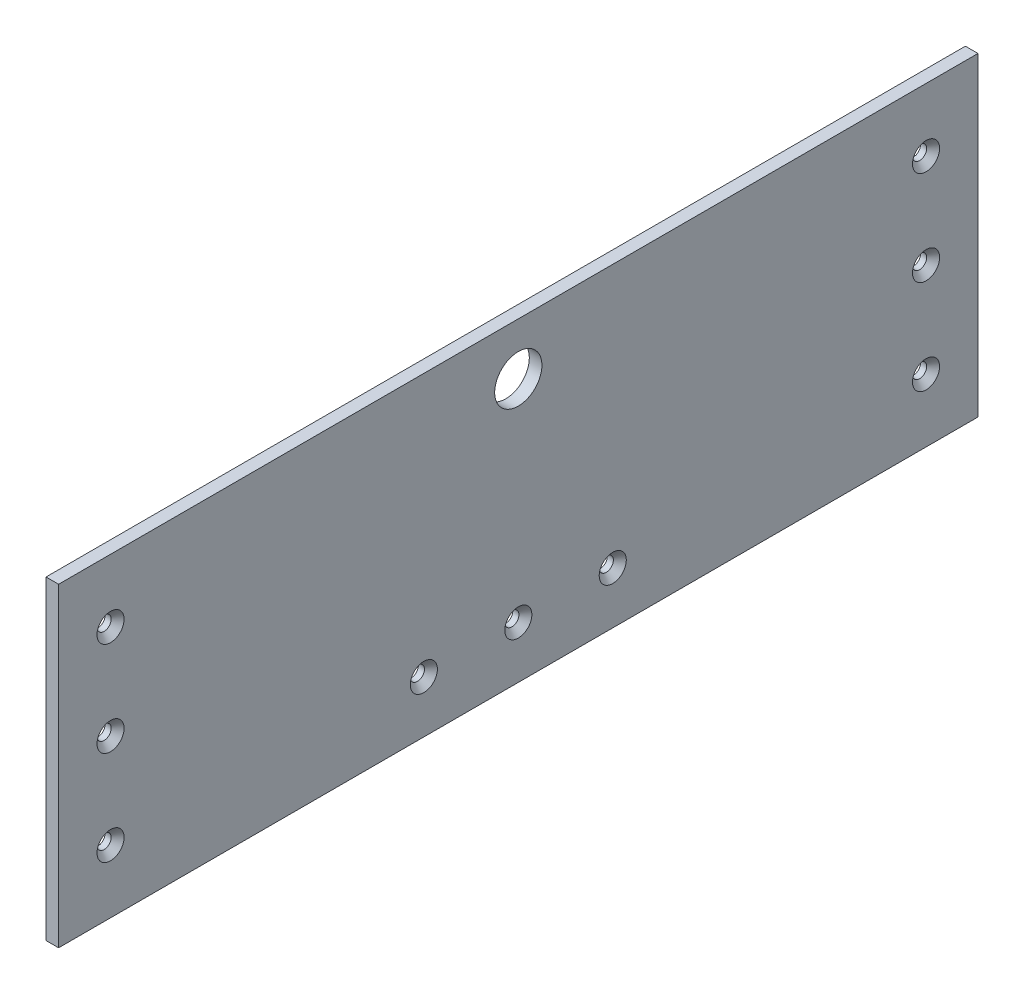
ISO-10303-21;
HEADER;
FILE_DESCRIPTION(('STEP AP214'),'2;1');
FILE_NAME('part.step','',(''),(''),'','','');
FILE_SCHEMA(('AUTOMOTIVE_DESIGN { 1 0 10303 214 1 1 1 1 }'));
ENDSEC;
DATA;
#1=APPLICATION_CONTEXT('core data for automotive mechanical design processes');
#2=APPLICATION_PROTOCOL_DEFINITION('international standard','automotive_design',2000,#1);
#3=PRODUCT_CONTEXT('',#1,'mechanical');
#4=PRODUCT('Part','Part','',(#3));
#5=PRODUCT_RELATED_PRODUCT_CATEGORY('part','',(#4));
#6=PRODUCT_DEFINITION_FORMATION('','',#4);
#7=PRODUCT_DEFINITION_CONTEXT('part definition',#1,'design');
#8=PRODUCT_DEFINITION('design','',#6,#7);
#9=PRODUCT_DEFINITION_SHAPE('','',#8);
#10=(LENGTH_UNIT() NAMED_UNIT(*) SI_UNIT(.MILLI.,.METRE.));
#11=(NAMED_UNIT(*) PLANE_ANGLE_UNIT() SI_UNIT($,.RADIAN.));
#12=(NAMED_UNIT(*) SI_UNIT($,.STERADIAN.) SOLID_ANGLE_UNIT());
#13=UNCERTAINTY_MEASURE_WITH_UNIT(LENGTH_MEASURE(1.E-05),#10,'distance_accuracy_value','');
#14=(GEOMETRIC_REPRESENTATION_CONTEXT(3) GLOBAL_UNCERTAINTY_ASSIGNED_CONTEXT((#13)) GLOBAL_UNIT_ASSIGNED_CONTEXT((#10,
#11,#12)) REPRESENTATION_CONTEXT('',''));
#15=CARTESIAN_POINT('',(0.,0.,0.));
#16=DIRECTION('',(0.,0.,1.));
#17=DIRECTION('',(1.,0.,0.));
#18=AXIS2_PLACEMENT_3D('',#15,#16,#17);
#19=CARTESIAN_POINT('',(3.99999999996226,30.,-129.5));
#20=DIRECTION('',(1.,0.,0.));
#21=DIRECTION('',(0.,0.,-1.));
#22=AXIS2_PLACEMENT_3D('',#19,#20,#21);
#23=CONICAL_SURFACE('',#22,4.29999999995112,0.785398163397448);
#24=CARTESIAN_POINT('',(1.95,30.,-129.5));
#25=DIRECTION('',(1.,0.,0.));
#26=DIRECTION('',(0.,0.,-1.));
#27=AXIS2_PLACEMENT_3D('',#24,#25,#26);
#28=CIRCLE('',#27,2.25);
#29=CARTESIAN_POINT('',(1.95,30.,-131.75));
#30=VERTEX_POINT('',#29);
#31=EDGE_CURVE('E106',#30,#30,#28,.F.);
#32=ORIENTED_EDGE('',*,*,#31,.T.);
#33=EDGE_LOOP('',(#32));
#34=FACE_BOUND('',#33,.T.);
#35=CARTESIAN_POINT('',(4.0000000000191,30.,-129.5));
#36=DIRECTION('',(1.,0.,0.));
#37=DIRECTION('',(0.,0.,-1.));
#38=AXIS2_PLACEMENT_3D('',#35,#36,#37);
#39=CIRCLE('',#38,4.30000000000796);
#40=CARTESIAN_POINT('',(4.0000000000191,30.,-133.800000000008));
#41=VERTEX_POINT('',#40);
#42=EDGE_CURVE('E20',#41,#41,#39,.F.);
#43=ORIENTED_EDGE('',*,*,#42,.F.);
#44=EDGE_LOOP('',(#43));
#45=FACE_BOUND('',#44,.T.);
#46=ADVANCED_FACE('F17',(#34,#45),#23,.F.);
#47=CARTESIAN_POINT('',(3.99999999990541,0.,-129.5));
#48=DIRECTION('',(1.,0.,0.));
#49=DIRECTION('',(0.,0.,-1.));
#50=AXIS2_PLACEMENT_3D('',#47,#48,#49);
#51=CONICAL_SURFACE('',#50,4.29999999995101,0.785398163397448);
#52=CARTESIAN_POINT('',(1.95,0.,-129.5));
#53=DIRECTION('',(1.,0.,0.));
#54=DIRECTION('',(0.,0.,-1.));
#55=AXIS2_PLACEMENT_3D('',#52,#53,#54);
#56=CIRCLE('',#55,2.25);
#57=CARTESIAN_POINT('',(1.95,0.,-131.75));
#58=VERTEX_POINT('',#57);
#59=EDGE_CURVE('E103',#58,#58,#56,.F.);
#60=ORIENTED_EDGE('',*,*,#59,.T.);
#61=EDGE_LOOP('',(#60));
#62=FACE_BOUND('',#61,.T.);
#63=CARTESIAN_POINT('',(4.0000000000191,0.,-129.5));
#64=DIRECTION('',(1.,0.,0.));
#65=DIRECTION('',(0.,0.,-1.));
#66=AXIS2_PLACEMENT_3D('',#63,#64,#65);
#67=CIRCLE('',#66,4.3000000000647);
#68=CARTESIAN_POINT('',(4.0000000000191,0.,-133.800000000065));
#69=VERTEX_POINT('',#68);
#70=EDGE_CURVE('E162',#69,#69,#67,.F.);
#71=ORIENTED_EDGE('',*,*,#70,.F.);
#72=EDGE_LOOP('',(#71));
#73=FACE_BOUND('',#72,.T.);
#74=ADVANCED_FACE('F171',(#62,#73),#51,.F.);
#75=CARTESIAN_POINT('',(3.99999999996226,-30.,-129.5));
#76=DIRECTION('',(1.,0.,0.));
#77=DIRECTION('',(0.,0.,-1.));
#78=AXIS2_PLACEMENT_3D('',#75,#76,#77);
#79=CONICAL_SURFACE('',#78,4.30000000000794,0.785398163411313);
#80=CARTESIAN_POINT('',(1.95,-30.,-129.5));
#81=DIRECTION('',(1.,0.,0.));
#82=DIRECTION('',(0.,0.,-1.));
#83=AXIS2_PLACEMENT_3D('',#80,#81,#82);
#84=CIRCLE('',#83,2.25);
#85=CARTESIAN_POINT('',(1.95,-30.,-131.75));
#86=VERTEX_POINT('',#85);
#87=EDGE_CURVE('E100',#86,#86,#84,.F.);
#88=ORIENTED_EDGE('',*,*,#87,.T.);
#89=EDGE_LOOP('',(#88));
#90=FACE_BOUND('',#89,.T.);
#91=CARTESIAN_POINT('',(3.99999999995496,-30.,-129.5));
#92=DIRECTION('',(1.,0.,0.));
#93=DIRECTION('',(0.,0.,-1.));
#94=AXIS2_PLACEMENT_3D('',#91,#92,#93);
#95=CIRCLE('',#94,4.30000000000064);
#96=CARTESIAN_POINT('',(3.99999999995496,-30.,-133.800000000001));
#97=VERTEX_POINT('',#96);
#98=EDGE_CURVE('E160',#97,#97,#95,.F.);
#99=ORIENTED_EDGE('',*,*,#98,.F.);
#100=EDGE_LOOP('',(#99));
#101=FACE_BOUND('',#100,.T.);
#102=ADVANCED_FACE('F177',(#90,#101),#79,.F.);
#103=CARTESIAN_POINT('',(3.99999999996226,-30.0000000000002,129.5));
#104=DIRECTION('',(1.,0.,0.));
#105=DIRECTION('',(0.,0.,-1.));
#106=AXIS2_PLACEMENT_3D('',#103,#104,#105);
#107=CONICAL_SURFACE('',#106,4.29999999993644,0.785398163397448);
#108=CARTESIAN_POINT('',(1.95,-30.0000000000002,129.5));
#109=DIRECTION('',(1.,0.,0.));
#110=DIRECTION('',(0.,0.,-1.));
#111=AXIS2_PLACEMENT_3D('',#108,#109,#110);
#112=CIRCLE('',#111,2.25);
#113=CARTESIAN_POINT('',(1.95,-30.0000000000002,127.25));
#114=VERTEX_POINT('',#113);
#115=EDGE_CURVE('E97',#114,#114,#112,.F.);
#116=ORIENTED_EDGE('',*,*,#115,.T.);
#117=EDGE_LOOP('',(#116));
#118=FACE_BOUND('',#117,.T.);
#119=CARTESIAN_POINT('',(4.0000000000191,-30.0000000000002,129.5));
#120=DIRECTION('',(1.,0.,0.));
#121=DIRECTION('',(0.,0.,-1.));
#122=AXIS2_PLACEMENT_3D('',#119,#120,#121);
#123=CIRCLE('',#122,4.29999999999328);
#124=CARTESIAN_POINT('',(4.0000000000191,-30.0000000000002,125.200000000007));
#125=VERTEX_POINT('',#124);
#126=EDGE_CURVE('E157',#125,#125,#123,.F.);
#127=ORIENTED_EDGE('',*,*,#126,.F.);
#128=EDGE_LOOP('',(#127));
#129=FACE_BOUND('',#128,.T.);
#130=ADVANCED_FACE('F260',(#118,#129),#107,.F.);
#131=CARTESIAN_POINT('',(3.99999999984857,-1.52655665885959E-13,129.5));
#132=DIRECTION('',(1.,0.,0.));
#133=DIRECTION('',(0.,0.,-1.));
#134=AXIS2_PLACEMENT_3D('',#131,#132,#133);
#135=CONICAL_SURFACE('',#134,4.29999999987962,0.785398163383584);
#136=CARTESIAN_POINT('',(1.95,-1.52655665885959E-13,129.5));
#137=DIRECTION('',(1.,0.,0.));
#138=DIRECTION('',(0.,0.,-1.));
#139=AXIS2_PLACEMENT_3D('',#136,#137,#138);
#140=CIRCLE('',#139,2.25);
#141=CARTESIAN_POINT('',(1.95,-1.52655665885959E-13,127.25));
#142=VERTEX_POINT('',#141);
#143=EDGE_CURVE('E94',#142,#142,#140,.F.);
#144=ORIENTED_EDGE('',*,*,#143,.T.);
#145=EDGE_LOOP('',(#144));
#146=FACE_BOUND('',#145,.T.);
#147=CARTESIAN_POINT('',(3.99999999996226,-1.52655665885959E-13,129.5));
#148=DIRECTION('',(1.,0.,0.));
#149=DIRECTION('',(0.,0.,-1.));
#150=AXIS2_PLACEMENT_3D('',#147,#148,#149);
#151=CIRCLE('',#150,4.29999999999331);
#152=CARTESIAN_POINT('',(3.99999999996226,-1.52655665885959E-13,125.200000000007));
#153=VERTEX_POINT('',#152);
#154=EDGE_CURVE('E154',#153,#153,#151,.F.);
#155=ORIENTED_EDGE('',*,*,#154,.F.);
#156=EDGE_LOOP('',(#155));
#157=FACE_BOUND('',#156,.T.);
#158=ADVANCED_FACE('F256',(#146,#157),#135,.F.);
#159=CARTESIAN_POINT('',(3.99999999996226,29.9999999999998,129.5));
#160=DIRECTION('',(1.,0.,0.));
#161=DIRECTION('',(0.,0.,-1.));
#162=AXIS2_PLACEMENT_3D('',#159,#160,#161);
#163=CONICAL_SURFACE('',#162,4.29999999993647,0.785398163397448);
#164=CARTESIAN_POINT('',(1.95,29.9999999999998,129.5));
#165=DIRECTION('',(1.,0.,0.));
#166=DIRECTION('',(0.,0.,-1.));
#167=AXIS2_PLACEMENT_3D('',#164,#165,#166);
#168=CIRCLE('',#167,2.25);
#169=CARTESIAN_POINT('',(1.95,29.9999999999998,127.25));
#170=VERTEX_POINT('',#169);
#171=EDGE_CURVE('E91',#170,#170,#168,.F.);
#172=ORIENTED_EDGE('',*,*,#171,.T.);
#173=EDGE_LOOP('',(#172));
#174=FACE_BOUND('',#173,.T.);
#175=CARTESIAN_POINT('',(4.0000000000191,29.9999999999998,129.5));
#176=DIRECTION('',(1.,0.,0.));
#177=DIRECTION('',(0.,0.,-1.));
#178=AXIS2_PLACEMENT_3D('',#175,#176,#177);
#179=CIRCLE('',#178,4.29999999999331);
#180=CARTESIAN_POINT('',(4.0000000000191,29.9999999999998,125.200000000007));
#181=VERTEX_POINT('',#180);
#182=EDGE_CURVE('E151',#181,#181,#179,.F.);
#183=ORIENTED_EDGE('',*,*,#182,.F.);
#184=EDGE_LOOP('',(#183));
#185=FACE_BOUND('',#184,.T.);
#186=ADVANCED_FACE('F252',(#174,#185),#163,.F.);
#187=CARTESIAN_POINT('',(3.99999999984857,-33.5,30.));
#188=DIRECTION('',(1.,0.,0.));
#189=DIRECTION('',(0.,0.,-1.));
#190=AXIS2_PLACEMENT_3D('',#187,#188,#189);
#191=CONICAL_SURFACE('',#190,4.29999999991427,0.785398163411313);
#192=CARTESIAN_POINT('',(1.95,-33.5,30.));
#193=DIRECTION('',(1.,0.,0.));
#194=DIRECTION('',(0.,0.,-1.));
#195=AXIS2_PLACEMENT_3D('',#192,#193,#194);
#196=CIRCLE('',#195,2.25);
#197=CARTESIAN_POINT('',(1.95,-33.5,27.75));
#198=VERTEX_POINT('',#197);
#199=EDGE_CURVE('E88',#198,#198,#196,.F.);
#200=ORIENTED_EDGE('',*,*,#199,.T.);
#201=EDGE_LOOP('',(#200));
#202=FACE_BOUND('',#201,.T.);
#203=CARTESIAN_POINT('',(3.99999999987809,-33.5,30.));
#204=DIRECTION('',(1.,0.,0.));
#205=DIRECTION('',(0.,0.,-1.));
#206=AXIS2_PLACEMENT_3D('',#203,#204,#205);
#207=CIRCLE('',#206,4.29999999994379);
#208=CARTESIAN_POINT('',(3.99999999987809,-33.5,25.7000000000562));
#209=VERTEX_POINT('',#208);
#210=EDGE_CURVE('E148',#209,#209,#207,.F.);
#211=ORIENTED_EDGE('',*,*,#210,.F.);
#212=EDGE_LOOP('',(#211));
#213=FACE_BOUND('',#212,.T.);
#214=ADVANCED_FACE('F248',(#202,#213),#191,.F.);
#215=CARTESIAN_POINT('',(3.99999999990541,-33.5,0.));
#216=DIRECTION('',(1.,0.,0.));
#217=DIRECTION('',(0.,0.,-1.));
#218=AXIS2_PLACEMENT_3D('',#215,#216,#217);
#219=CONICAL_SURFACE('',#218,4.29999999994386,0.785398163397448);
#220=CARTESIAN_POINT('',(1.95,-33.5,0.));
#221=DIRECTION('',(1.,0.,0.));
#222=DIRECTION('',(0.,0.,-1.));
#223=AXIS2_PLACEMENT_3D('',#220,#221,#222);
#224=CIRCLE('',#223,2.25);
#225=CARTESIAN_POINT('',(1.95,-33.5,-2.24999999999993));
#226=VERTEX_POINT('',#225);
#227=EDGE_CURVE('E85',#226,#226,#224,.F.);
#228=ORIENTED_EDGE('',*,*,#227,.T.);
#229=EDGE_LOOP('',(#228));
#230=FACE_BOUND('',#229,.T.);
#231=CARTESIAN_POINT('',(3.99999999996226,-33.5,0.));
#232=DIRECTION('',(1.,0.,0.));
#233=DIRECTION('',(0.,0.,-1.));
#234=AXIS2_PLACEMENT_3D('',#231,#232,#233);
#235=CIRCLE('',#234,4.3000000000007);
#236=CARTESIAN_POINT('',(3.99999999996226,-33.5,-4.30000000000064));
#237=VERTEX_POINT('',#236);
#238=EDGE_CURVE('E145',#237,#237,#235,.F.);
#239=ORIENTED_EDGE('',*,*,#238,.F.);
#240=EDGE_LOOP('',(#239));
#241=FACE_BOUND('',#240,.T.);
#242=ADVANCED_FACE('F244',(#230,#241),#219,.F.);
#243=CARTESIAN_POINT('',(3.99999999990541,-33.5,-30.));
#244=DIRECTION('',(1.,0.,0.));
#245=DIRECTION('',(0.,0.,-1.));
#246=AXIS2_PLACEMENT_3D('',#243,#244,#245);
#247=CONICAL_SURFACE('',#246,4.29999999991655,0.785398163411313);
#248=CARTESIAN_POINT('',(1.95,-33.5,-30.));
#249=DIRECTION('',(1.,0.,0.));
#250=DIRECTION('',(0.,0.,-1.));
#251=AXIS2_PLACEMENT_3D('',#248,#249,#250);
#252=CIRCLE('',#251,2.25);
#253=CARTESIAN_POINT('',(1.95,-33.5,-32.25));
#254=VERTEX_POINT('',#253);
#255=EDGE_CURVE('E82',#254,#254,#252,.F.);
#256=ORIENTED_EDGE('',*,*,#255,.T.);
#257=EDGE_LOOP('',(#256));
#258=FACE_BOUND('',#257,.T.);
#259=CARTESIAN_POINT('',(3.9999999999895,-33.5,-30.));
#260=DIRECTION('',(1.,0.,0.));
#261=DIRECTION('',(0.,0.,-1.));
#262=AXIS2_PLACEMENT_3D('',#259,#260,#261);
#263=CIRCLE('',#262,4.30000000000064);
#264=CARTESIAN_POINT('',(3.9999999999895,-33.5,-34.3000000000006));
#265=VERTEX_POINT('',#264);
#266=EDGE_CURVE('E109',#265,#265,#263,.F.);
#267=ORIENTED_EDGE('',*,*,#266,.F.);
#268=EDGE_LOOP('',(#267));
#269=FACE_BOUND('',#268,.T.);
#270=ADVANCED_FACE('F241',(#258,#269),#247,.F.);
#271=CARTESIAN_POINT('',(4.,0.,0.));
#272=DIRECTION('',(1.,0.,0.));
#273=DIRECTION('',(0.,0.,-1.));
#274=AXIS2_PLACEMENT_3D('',#271,#272,#273);
#275=PLANE('',#274);
#276=DIRECTION('',(0.,1.,0.));
#277=VECTOR('',#276,1.);
#278=CARTESIAN_POINT('',(4.,-50.,-146.));
#279=LINE('',#278,#277);
#280=CARTESIAN_POINT('',(4.,-50.,-146.));
#281=VERTEX_POINT('',#280);
#282=CARTESIAN_POINT('',(4.,50.,-146.));
#283=VERTEX_POINT('',#282);
#284=EDGE_CURVE('E55',#281,#283,#279,.T.);
#285=ORIENTED_EDGE('',*,*,#284,.T.);
#286=DIRECTION('',(0.,0.,-1.));
#287=VECTOR('',#286,1.);
#288=CARTESIAN_POINT('',(4.,50.,-146.));
#289=LINE('',#288,#287);
#290=CARTESIAN_POINT('',(4.,50.,146.));
#291=VERTEX_POINT('',#290);
#292=EDGE_CURVE('E482',#283,#291,#289,.F.);
#293=ORIENTED_EDGE('',*,*,#292,.T.);
#294=DIRECTION('',(0.,1.,0.));
#295=VECTOR('',#294,1.);
#296=CARTESIAN_POINT('',(4.,-50.,146.));
#297=LINE('',#296,#295);
#298=CARTESIAN_POINT('',(4.,-50.,146.));
#299=VERTEX_POINT('',#298);
#300=EDGE_CURVE('E61',#291,#299,#297,.F.);
#301=ORIENTED_EDGE('',*,*,#300,.T.);
#302=DIRECTION('',(0.,0.,1.));
#303=VECTOR('',#302,1.);
#304=CARTESIAN_POINT('',(4.,-50.,-146.));
#305=LINE('',#304,#303);
#306=EDGE_CURVE('E58',#299,#281,#305,.F.);
#307=ORIENTED_EDGE('',*,*,#306,.T.);
#308=EDGE_LOOP('',(#285,#293,#301,#307));
#309=FACE_BOUND('',#308,.T.);
#310=CARTESIAN_POINT('',(4.,33.5,0.));
#311=DIRECTION('',(1.,0.,0.));
#312=DIRECTION('',(0.,0.,-1.));
#313=AXIS2_PLACEMENT_3D('',#310,#311,#312);
#314=CIRCLE('',#313,7.49999999999999);
#315=CARTESIAN_POINT('',(4.,33.5,-7.49999999999999));
#316=VERTEX_POINT('',#315);
#317=EDGE_CURVE('E67',#316,#316,#314,.F.);
#318=ORIENTED_EDGE('',*,*,#317,.T.);
#319=EDGE_LOOP('',(#318));
#320=FACE_BOUND('',#319,.T.);
#321=ORIENTED_EDGE('',*,*,#266,.T.);
#322=EDGE_LOOP('',(#321));
#323=FACE_BOUND('',#322,.T.);
#324=ORIENTED_EDGE('',*,*,#238,.T.);
#325=EDGE_LOOP('',(#324));
#326=FACE_BOUND('',#325,.T.);
#327=ORIENTED_EDGE('',*,*,#210,.T.);
#328=EDGE_LOOP('',(#327));
#329=FACE_BOUND('',#328,.T.);
#330=ORIENTED_EDGE('',*,*,#182,.T.);
#331=EDGE_LOOP('',(#330));
#332=FACE_BOUND('',#331,.T.);
#333=ORIENTED_EDGE('',*,*,#154,.T.);
#334=EDGE_LOOP('',(#333));
#335=FACE_BOUND('',#334,.T.);
#336=ORIENTED_EDGE('',*,*,#126,.T.);
#337=EDGE_LOOP('',(#336));
#338=FACE_BOUND('',#337,.T.);
#339=ORIENTED_EDGE('',*,*,#98,.T.);
#340=EDGE_LOOP('',(#339));
#341=FACE_BOUND('',#340,.T.);
#342=ORIENTED_EDGE('',*,*,#70,.T.);
#343=EDGE_LOOP('',(#342));
#344=FACE_BOUND('',#343,.T.);
#345=ORIENTED_EDGE('',*,*,#42,.T.);
#346=EDGE_LOOP('',(#345));
#347=FACE_BOUND('',#346,.T.);
#348=ADVANCED_FACE('F59',(#309,#320,#323,#326,#329,#332,#335,#338,#341,#344,#347),#275,.T.);
#349=CARTESIAN_POINT('',(4.,30.,-129.5));
#350=DIRECTION('',(1.,0.,0.));
#351=DIRECTION('',(0.,0.,-1.));
#352=AXIS2_PLACEMENT_3D('',#349,#350,#351);
#353=CYLINDRICAL_SURFACE('',#352,2.25);
#354=CARTESIAN_POINT('',(0.,30.,-129.5));
#355=DIRECTION('',(1.,0.,0.));
#356=DIRECTION('',(0.,0.,-1.));
#357=AXIS2_PLACEMENT_3D('',#354,#355,#356);
#358=CIRCLE('',#357,2.25);
#359=CARTESIAN_POINT('',(0.,30.,-131.75));
#360=VERTEX_POINT('',#359);
#361=EDGE_CURVE('E137',#360,#360,#358,.F.);
#362=ORIENTED_EDGE('',*,*,#361,.T.);
#363=EDGE_LOOP('',(#362));
#364=FACE_BOUND('',#363,.T.);
#365=ORIENTED_EDGE('',*,*,#31,.F.);
#366=EDGE_LOOP('',(#365));
#367=FACE_BOUND('',#366,.T.);
#368=ADVANCED_FACE('F234',(#364,#367),#353,.F.);
#369=CARTESIAN_POINT('',(4.,0.,-129.5));
#370=DIRECTION('',(1.,0.,0.));
#371=DIRECTION('',(0.,0.,-1.));
#372=AXIS2_PLACEMENT_3D('',#369,#370,#371);
#373=CYLINDRICAL_SURFACE('',#372,2.25);
#374=CARTESIAN_POINT('',(0.,0.,-129.5));
#375=DIRECTION('',(1.,0.,0.));
#376=DIRECTION('',(0.,0.,-1.));
#377=AXIS2_PLACEMENT_3D('',#374,#375,#376);
#378=CIRCLE('',#377,2.25);
#379=CARTESIAN_POINT('',(0.,0.,-131.75));
#380=VERTEX_POINT('',#379);
#381=EDGE_CURVE('E134',#380,#380,#378,.F.);
#382=ORIENTED_EDGE('',*,*,#381,.T.);
#383=EDGE_LOOP('',(#382));
#384=FACE_BOUND('',#383,.T.);
#385=ORIENTED_EDGE('',*,*,#59,.F.);
#386=EDGE_LOOP('',(#385));
#387=FACE_BOUND('',#386,.T.);
#388=ADVANCED_FACE('F230',(#384,#387),#373,.F.);
#389=CARTESIAN_POINT('',(4.,-30.,-129.5));
#390=DIRECTION('',(1.,0.,0.));
#391=DIRECTION('',(0.,0.,-1.));
#392=AXIS2_PLACEMENT_3D('',#389,#390,#391);
#393=CYLINDRICAL_SURFACE('',#392,2.25);
#394=CARTESIAN_POINT('',(0.,-30.,-129.5));
#395=DIRECTION('',(1.,0.,0.));
#396=DIRECTION('',(0.,0.,-1.));
#397=AXIS2_PLACEMENT_3D('',#394,#395,#396);
#398=CIRCLE('',#397,2.25);
#399=CARTESIAN_POINT('',(0.,-30.,-131.75));
#400=VERTEX_POINT('',#399);
#401=EDGE_CURVE('E131',#400,#400,#398,.F.);
#402=ORIENTED_EDGE('',*,*,#401,.T.);
#403=EDGE_LOOP('',(#402));
#404=FACE_BOUND('',#403,.T.);
#405=ORIENTED_EDGE('',*,*,#87,.F.);
#406=EDGE_LOOP('',(#405));
#407=FACE_BOUND('',#406,.T.);
#408=ADVANCED_FACE('F226',(#404,#407),#393,.F.);
#409=CARTESIAN_POINT('',(4.,-30.0000000000002,129.5));
#410=DIRECTION('',(1.,0.,0.));
#411=DIRECTION('',(0.,0.,-1.));
#412=AXIS2_PLACEMENT_3D('',#409,#410,#411);
#413=CYLINDRICAL_SURFACE('',#412,2.25);
#414=CARTESIAN_POINT('',(0.,-30.0000000000002,129.5));
#415=DIRECTION('',(1.,0.,0.));
#416=DIRECTION('',(0.,0.,-1.));
#417=AXIS2_PLACEMENT_3D('',#414,#415,#416);
#418=CIRCLE('',#417,2.25);
#419=CARTESIAN_POINT('',(0.,-30.0000000000002,127.25));
#420=VERTEX_POINT('',#419);
#421=EDGE_CURVE('E128',#420,#420,#418,.F.);
#422=ORIENTED_EDGE('',*,*,#421,.T.);
#423=EDGE_LOOP('',(#422));
#424=FACE_BOUND('',#423,.T.);
#425=ORIENTED_EDGE('',*,*,#115,.F.);
#426=EDGE_LOOP('',(#425));
#427=FACE_BOUND('',#426,.T.);
#428=ADVANCED_FACE('F222',(#424,#427),#413,.F.);
#429=CARTESIAN_POINT('',(4.,-1.52655665885959E-13,129.5));
#430=DIRECTION('',(1.,0.,0.));
#431=DIRECTION('',(0.,0.,-1.));
#432=AXIS2_PLACEMENT_3D('',#429,#430,#431);
#433=CYLINDRICAL_SURFACE('',#432,2.25);
#434=CARTESIAN_POINT('',(0.,-1.52655665885959E-13,129.5));
#435=DIRECTION('',(1.,0.,0.));
#436=DIRECTION('',(0.,0.,-1.));
#437=AXIS2_PLACEMENT_3D('',#434,#435,#436);
#438=CIRCLE('',#437,2.25);
#439=CARTESIAN_POINT('',(0.,-1.52655665885959E-13,127.25));
#440=VERTEX_POINT('',#439);
#441=EDGE_CURVE('E125',#440,#440,#438,.F.);
#442=ORIENTED_EDGE('',*,*,#441,.T.);
#443=EDGE_LOOP('',(#442));
#444=FACE_BOUND('',#443,.T.);
#445=ORIENTED_EDGE('',*,*,#143,.F.);
#446=EDGE_LOOP('',(#445));
#447=FACE_BOUND('',#446,.T.);
#448=ADVANCED_FACE('F218',(#444,#447),#433,.F.);
#449=CARTESIAN_POINT('',(4.,29.9999999999998,129.5));
#450=DIRECTION('',(1.,0.,0.));
#451=DIRECTION('',(0.,0.,-1.));
#452=AXIS2_PLACEMENT_3D('',#449,#450,#451);
#453=CYLINDRICAL_SURFACE('',#452,2.25);
#454=CARTESIAN_POINT('',(0.,29.9999999999998,129.5));
#455=DIRECTION('',(1.,0.,0.));
#456=DIRECTION('',(0.,0.,-1.));
#457=AXIS2_PLACEMENT_3D('',#454,#455,#456);
#458=CIRCLE('',#457,2.25);
#459=CARTESIAN_POINT('',(0.,29.9999999999998,127.25));
#460=VERTEX_POINT('',#459);
#461=EDGE_CURVE('E122',#460,#460,#458,.F.);
#462=ORIENTED_EDGE('',*,*,#461,.T.);
#463=EDGE_LOOP('',(#462));
#464=FACE_BOUND('',#463,.T.);
#465=ORIENTED_EDGE('',*,*,#171,.F.);
#466=EDGE_LOOP('',(#465));
#467=FACE_BOUND('',#466,.T.);
#468=ADVANCED_FACE('F214',(#464,#467),#453,.F.);
#469=CARTESIAN_POINT('',(4.,-33.5,30.));
#470=DIRECTION('',(1.,0.,0.));
#471=DIRECTION('',(0.,0.,-1.));
#472=AXIS2_PLACEMENT_3D('',#469,#470,#471);
#473=CYLINDRICAL_SURFACE('',#472,2.25);
#474=CARTESIAN_POINT('',(0.,-33.5,30.));
#475=DIRECTION('',(1.,0.,0.));
#476=DIRECTION('',(0.,0.,-1.));
#477=AXIS2_PLACEMENT_3D('',#474,#475,#476);
#478=CIRCLE('',#477,2.25);
#479=CARTESIAN_POINT('',(0.,-33.5,27.75));
#480=VERTEX_POINT('',#479);
#481=EDGE_CURVE('E119',#480,#480,#478,.F.);
#482=ORIENTED_EDGE('',*,*,#481,.T.);
#483=EDGE_LOOP('',(#482));
#484=FACE_BOUND('',#483,.T.);
#485=ORIENTED_EDGE('',*,*,#199,.F.);
#486=EDGE_LOOP('',(#485));
#487=FACE_BOUND('',#486,.T.);
#488=ADVANCED_FACE('F210',(#484,#487),#473,.F.);
#489=CARTESIAN_POINT('',(4.,-33.5,0.));
#490=DIRECTION('',(1.,0.,0.));
#491=DIRECTION('',(0.,0.,-1.));
#492=AXIS2_PLACEMENT_3D('',#489,#490,#491);
#493=CYLINDRICAL_SURFACE('',#492,2.25);
#494=CARTESIAN_POINT('',(0.,-33.5,0.));
#495=DIRECTION('',(1.,0.,0.));
#496=DIRECTION('',(0.,0.,-1.));
#497=AXIS2_PLACEMENT_3D('',#494,#495,#496);
#498=CIRCLE('',#497,2.25);
#499=CARTESIAN_POINT('',(0.,-33.5,-2.24999999999993));
#500=VERTEX_POINT('',#499);
#501=EDGE_CURVE('E116',#500,#500,#498,.F.);
#502=ORIENTED_EDGE('',*,*,#501,.T.);
#503=EDGE_LOOP('',(#502));
#504=FACE_BOUND('',#503,.T.);
#505=ORIENTED_EDGE('',*,*,#227,.F.);
#506=EDGE_LOOP('',(#505));
#507=FACE_BOUND('',#506,.T.);
#508=ADVANCED_FACE('F206',(#504,#507),#493,.F.);
#509=CARTESIAN_POINT('',(4.,-33.5,-30.));
#510=DIRECTION('',(1.,0.,0.));
#511=DIRECTION('',(0.,0.,-1.));
#512=AXIS2_PLACEMENT_3D('',#509,#510,#511);
#513=CYLINDRICAL_SURFACE('',#512,2.25);
#514=CARTESIAN_POINT('',(0.,-33.5,-30.));
#515=DIRECTION('',(1.,0.,0.));
#516=DIRECTION('',(0.,0.,-1.));
#517=AXIS2_PLACEMENT_3D('',#514,#515,#516);
#518=CIRCLE('',#517,2.25);
#519=CARTESIAN_POINT('',(0.,-33.5,-32.25));
#520=VERTEX_POINT('',#519);
#521=EDGE_CURVE('E113',#520,#520,#518,.F.);
#522=ORIENTED_EDGE('',*,*,#521,.T.);
#523=EDGE_LOOP('',(#522));
#524=FACE_BOUND('',#523,.T.);
#525=ORIENTED_EDGE('',*,*,#255,.F.);
#526=EDGE_LOOP('',(#525));
#527=FACE_BOUND('',#526,.T.);
#528=ADVANCED_FACE('F202',(#524,#527),#513,.F.);
#529=CARTESIAN_POINT('',(4.,33.5,0.));
#530=DIRECTION('',(1.,0.,0.));
#531=DIRECTION('',(0.,0.,-1.));
#532=AXIS2_PLACEMENT_3D('',#529,#530,#531);
#533=CYLINDRICAL_SURFACE('',#532,7.49999999999999);
#534=CARTESIAN_POINT('',(0.,33.5,0.));
#535=DIRECTION('',(1.,0.,0.));
#536=DIRECTION('',(0.,0.,-1.));
#537=AXIS2_PLACEMENT_3D('',#534,#535,#536);
#538=CIRCLE('',#537,7.49999999999999);
#539=CARTESIAN_POINT('',(0.,33.5,-7.49999999999999));
#540=VERTEX_POINT('',#539);
#541=EDGE_CURVE('E110',#540,#540,#538,.F.);
#542=ORIENTED_EDGE('',*,*,#541,.T.);
#543=EDGE_LOOP('',(#542));
#544=FACE_BOUND('',#543,.T.);
#545=ORIENTED_EDGE('',*,*,#317,.F.);
#546=EDGE_LOOP('',(#545));
#547=FACE_BOUND('',#546,.T.);
#548=ADVANCED_FACE('F199',(#544,#547),#533,.F.);
#549=CARTESIAN_POINT('',(4.,-50.,-146.));
#550=DIRECTION('',(0.,1.,0.));
#551=DIRECTION('',(0.,0.,1.));
#552=AXIS2_PLACEMENT_3D('',#549,#550,#551);
#553=PLANE('',#552);
#554=DIRECTION('',(1.,0.,0.));
#555=VECTOR('',#554,1.);
#556=CARTESIAN_POINT('',(4.,-50.,-146.));
#557=LINE('',#556,#555);
#558=CARTESIAN_POINT('',(0.,-50.,-146.));
#559=VERTEX_POINT('',#558);
#560=EDGE_CURVE('E66',#559,#281,#557,.T.);
#561=ORIENTED_EDGE('',*,*,#560,.T.);
#562=ORIENTED_EDGE('',*,*,#306,.F.);
#563=DIRECTION('',(-1.,0.,0.));
#564=VECTOR('',#563,1.);
#565=CARTESIAN_POINT('',(4.,-50.,146.));
#566=LINE('',#565,#564);
#567=CARTESIAN_POINT('',(0.,-50.,146.));
#568=VERTEX_POINT('',#567);
#569=EDGE_CURVE('E140',#299,#568,#566,.T.);
#570=ORIENTED_EDGE('',*,*,#569,.T.);
#571=DIRECTION('',(0.,0.,-1.));
#572=VECTOR('',#571,1.);
#573=CARTESIAN_POINT('',(0.,-50.,0.));
#574=LINE('',#573,#572);
#575=EDGE_CURVE('E78',#568,#559,#574,.T.);
#576=ORIENTED_EDGE('',*,*,#575,.T.);
#577=EDGE_LOOP('',(#561,#562,#570,#576));
#578=FACE_BOUND('',#577,.T.);
#579=ADVANCED_FACE('F77',(#578),#553,.F.);
#580=CARTESIAN_POINT('',(4.,-50.,-146.));
#581=DIRECTION('',(0.,0.,1.));
#582=DIRECTION('',(1.,0.,0.));
#583=AXIS2_PLACEMENT_3D('',#580,#581,#582);
#584=PLANE('',#583);
#585=DIRECTION('',(1.,0.,0.));
#586=VECTOR('',#585,1.);
#587=CARTESIAN_POINT('',(4.,50.,-146.));
#588=LINE('',#587,#586);
#589=CARTESIAN_POINT('',(0.,50.,-146.));
#590=VERTEX_POINT('',#589);
#591=EDGE_CURVE('E74',#590,#283,#588,.T.);
#592=ORIENTED_EDGE('',*,*,#591,.T.);
#593=ORIENTED_EDGE('',*,*,#284,.F.);
#594=ORIENTED_EDGE('',*,*,#560,.F.);
#595=DIRECTION('',(0.,1.,0.));
#596=VECTOR('',#595,1.);
#597=CARTESIAN_POINT('',(0.,0.,-146.));
#598=LINE('',#597,#596);
#599=EDGE_CURVE('E489',#559,#590,#598,.T.);
#600=ORIENTED_EDGE('',*,*,#599,.T.);
#601=EDGE_LOOP('',(#592,#593,#594,#600));
#602=FACE_BOUND('',#601,.T.);
#603=ADVANCED_FACE('F71',(#602),#584,.F.);
#604=CARTESIAN_POINT('',(4.,50.,-146.));
#605=DIRECTION('',(0.,-1.,0.));
#606=DIRECTION('',(0.,0.,-1.));
#607=AXIS2_PLACEMENT_3D('',#604,#605,#606);
#608=PLANE('',#607);
#609=DIRECTION('',(-1.,0.,0.));
#610=VECTOR('',#609,1.);
#611=CARTESIAN_POINT('',(4.,50.,146.));
#612=LINE('',#611,#610);
#613=CARTESIAN_POINT('',(0.,50.,146.));
#614=VERTEX_POINT('',#613);
#615=EDGE_CURVE('E34',#614,#291,#612,.F.);
#616=ORIENTED_EDGE('',*,*,#615,.T.);
#617=ORIENTED_EDGE('',*,*,#292,.F.);
#618=ORIENTED_EDGE('',*,*,#591,.F.);
#619=DIRECTION('',(0.,0.,-1.));
#620=VECTOR('',#619,1.);
#621=CARTESIAN_POINT('',(0.,50.,0.));
#622=LINE('',#621,#620);
#623=EDGE_CURVE('E26',#590,#614,#622,.F.);
#624=ORIENTED_EDGE('',*,*,#623,.T.);
#625=EDGE_LOOP('',(#616,#617,#618,#624));
#626=FACE_BOUND('',#625,.T.);
#627=ADVANCED_FACE('F187',(#626),#608,.F.);
#628=CARTESIAN_POINT('',(4.,-50.,146.));
#629=DIRECTION('',(0.,0.,-1.));
#630=DIRECTION('',(-1.,0.,0.));
#631=AXIS2_PLACEMENT_3D('',#628,#629,#630);
#632=PLANE('',#631);
#633=ORIENTED_EDGE('',*,*,#569,.F.);
#634=ORIENTED_EDGE('',*,*,#300,.F.);
#635=ORIENTED_EDGE('',*,*,#615,.F.);
#636=DIRECTION('',(0.,1.,0.));
#637=VECTOR('',#636,1.);
#638=CARTESIAN_POINT('',(0.,0.,146.));
#639=LINE('',#638,#637);
#640=EDGE_CURVE('E11',#614,#568,#639,.F.);
#641=ORIENTED_EDGE('',*,*,#640,.T.);
#642=EDGE_LOOP('',(#633,#634,#635,#641));
#643=FACE_BOUND('',#642,.T.);
#644=ADVANCED_FACE('F181',(#643),#632,.F.);
#645=CARTESIAN_POINT('',(0.,0.,0.));
#646=DIRECTION('',(1.,0.,0.));
#647=DIRECTION('',(0.,0.,-1.));
#648=AXIS2_PLACEMENT_3D('',#645,#646,#647);
#649=PLANE('',#648);
#650=ORIENTED_EDGE('',*,*,#623,.F.);
#651=ORIENTED_EDGE('',*,*,#599,.F.);
#652=ORIENTED_EDGE('',*,*,#575,.F.);
#653=ORIENTED_EDGE('',*,*,#640,.F.);
#654=EDGE_LOOP('',(#650,#651,#652,#653));
#655=FACE_BOUND('',#654,.T.);
#656=ORIENTED_EDGE('',*,*,#541,.F.);
#657=EDGE_LOOP('',(#656));
#658=FACE_BOUND('',#657,.T.);
#659=ORIENTED_EDGE('',*,*,#521,.F.);
#660=EDGE_LOOP('',(#659));
#661=FACE_BOUND('',#660,.T.);
#662=ORIENTED_EDGE('',*,*,#501,.F.);
#663=EDGE_LOOP('',(#662));
#664=FACE_BOUND('',#663,.T.);
#665=ORIENTED_EDGE('',*,*,#481,.F.);
#666=EDGE_LOOP('',(#665));
#667=FACE_BOUND('',#666,.T.);
#668=ORIENTED_EDGE('',*,*,#461,.F.);
#669=EDGE_LOOP('',(#668));
#670=FACE_BOUND('',#669,.T.);
#671=ORIENTED_EDGE('',*,*,#441,.F.);
#672=EDGE_LOOP('',(#671));
#673=FACE_BOUND('',#672,.T.);
#674=ORIENTED_EDGE('',*,*,#421,.F.);
#675=EDGE_LOOP('',(#674));
#676=FACE_BOUND('',#675,.T.);
#677=ORIENTED_EDGE('',*,*,#401,.F.);
#678=EDGE_LOOP('',(#677));
#679=FACE_BOUND('',#678,.T.);
#680=ORIENTED_EDGE('',*,*,#381,.F.);
#681=EDGE_LOOP('',(#680));
#682=FACE_BOUND('',#681,.T.);
#683=ORIENTED_EDGE('',*,*,#361,.F.);
#684=EDGE_LOOP('',(#683));
#685=FACE_BOUND('',#684,.T.);
#686=ADVANCED_FACE('F179',(#655,#658,#661,#664,#667,#670,#673,#676,#679,#682,#685),#649,.F.);
#687=CLOSED_SHELL('',(#46,#74,#102,#130,#158,#186,#214,#242,#270,#348,#368,#388,#408,#428,#448,
#468,#488,#508,#528,#548,#579,#603,#627,#644,#686));
#688=MANIFOLD_SOLID_BREP('B1',#687);
#689=ADVANCED_BREP_SHAPE_REPRESENTATION('',(#18,#688),#14);
#690=SHAPE_DEFINITION_REPRESENTATION(#9,#689);
ENDSEC;
END-ISO-10303-21;
